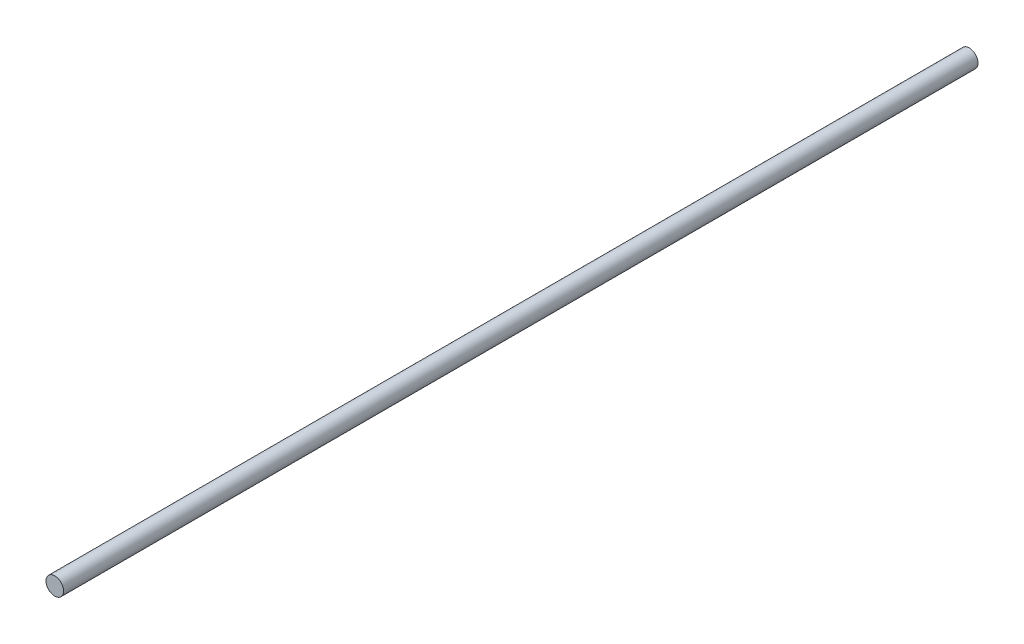
ISO-10303-21;
HEADER;
FILE_DESCRIPTION(('STEP AP214'),'2;1');
FILE_NAME('part.step','',(''),(''),'','','');
FILE_SCHEMA(('AUTOMOTIVE_DESIGN { 1 0 10303 214 1 1 1 1 }'));
ENDSEC;
DATA;
#1=APPLICATION_CONTEXT('core data for automotive mechanical design processes');
#2=APPLICATION_PROTOCOL_DEFINITION('international standard','automotive_design',2000,#1);
#3=PRODUCT_CONTEXT('',#1,'mechanical');
#4=PRODUCT('Part','Part','',(#3));
#5=PRODUCT_RELATED_PRODUCT_CATEGORY('part','',(#4));
#6=PRODUCT_DEFINITION_FORMATION('','',#4);
#7=PRODUCT_DEFINITION_CONTEXT('part definition',#1,'design');
#8=PRODUCT_DEFINITION('design','',#6,#7);
#9=PRODUCT_DEFINITION_SHAPE('','',#8);
#10=(LENGTH_UNIT() NAMED_UNIT(*) SI_UNIT(.MILLI.,.METRE.));
#11=(NAMED_UNIT(*) PLANE_ANGLE_UNIT() SI_UNIT($,.RADIAN.));
#12=(NAMED_UNIT(*) SI_UNIT($,.STERADIAN.) SOLID_ANGLE_UNIT());
#13=UNCERTAINTY_MEASURE_WITH_UNIT(LENGTH_MEASURE(1.E-05),#10,'distance_accuracy_value','');
#14=(GEOMETRIC_REPRESENTATION_CONTEXT(3) GLOBAL_UNCERTAINTY_ASSIGNED_CONTEXT((#13)) GLOBAL_UNIT_ASSIGNED_CONTEXT((#10,
#11,#12)) REPRESENTATION_CONTEXT('',''));
#15=CARTESIAN_POINT('',(0.,0.,0.));
#16=DIRECTION('',(0.,0.,1.));
#17=DIRECTION('',(1.,0.,0.));
#18=AXIS2_PLACEMENT_3D('',#15,#16,#17);
#19=CARTESIAN_POINT('',(0.,0.,104.));
#20=DIRECTION('',(0.,0.,-1.));
#21=DIRECTION('',(-1.,0.,0.));
#22=AXIS2_PLACEMENT_3D('',#19,#20,#21);
#23=CYLINDRICAL_SURFACE('',#22,1.);
#24=CARTESIAN_POINT('',(0.,0.,104.));
#25=DIRECTION('',(0.,0.,1.));
#26=DIRECTION('',(1.,0.,0.));
#27=AXIS2_PLACEMENT_3D('',#24,#25,#26);
#28=CIRCLE('',#27,1.);
#29=CARTESIAN_POINT('',(-1.,0.,104.));
#30=VERTEX_POINT('',#29);
#31=EDGE_CURVE('E10',#30,#30,#28,.T.);
#32=CARTESIAN_POINT('',(0.,0.,0.));
#33=DIRECTION('',(0.,0.,1.));
#34=DIRECTION('',(1.,0.,0.));
#35=AXIS2_PLACEMENT_3D('',#32,#33,#34);
#36=CIRCLE('',#35,1.);
#37=CARTESIAN_POINT('',(-1.,0.,0.));
#38=VERTEX_POINT('',#37);
#39=EDGE_CURVE('E34',#38,#38,#36,.T.);
#40=CARTESIAN_POINT('',(-1.,0.,104.));
#41=CARTESIAN_POINT('',(-1.,0.,102.916666666667));
#42=CARTESIAN_POINT('',(-1.,0.,101.833333333333));
#43=CARTESIAN_POINT('',(-1.,0.,99.6666666666667));
#44=CARTESIAN_POINT('',(-1.,0.,98.5833333333333));
#45=CARTESIAN_POINT('',(-1.,0.,96.4166666666667));
#46=CARTESIAN_POINT('',(-1.,0.,95.3333333333333));
#47=CARTESIAN_POINT('',(-1.,0.,93.1666666666666));
#48=CARTESIAN_POINT('',(-1.,0.,92.0833333333333));
#49=CARTESIAN_POINT('',(-1.,0.,89.9166666666667));
#50=CARTESIAN_POINT('',(-1.,0.,88.8333333333333));
#51=CARTESIAN_POINT('',(-1.,0.,86.6666666666667));
#52=CARTESIAN_POINT('',(-1.,0.,85.5833333333333));
#53=CARTESIAN_POINT('',(-1.,0.,83.4166666666667));
#54=CARTESIAN_POINT('',(-1.,0.,82.3333333333333));
#55=CARTESIAN_POINT('',(-1.,0.,80.1666666666666));
#56=CARTESIAN_POINT('',(-1.,0.,79.0833333333333));
#57=CARTESIAN_POINT('',(-1.,0.,76.9166666666666));
#58=CARTESIAN_POINT('',(-1.,0.,75.8333333333333));
#59=CARTESIAN_POINT('',(-1.,0.,73.6666666666667));
#60=CARTESIAN_POINT('',(-1.,0.,72.5833333333333));
#61=CARTESIAN_POINT('',(-1.,0.,70.4166666666667));
#62=CARTESIAN_POINT('',(-1.,0.,69.3333333333333));
#63=CARTESIAN_POINT('',(-1.,0.,67.1666666666667));
#64=CARTESIAN_POINT('',(-1.,0.,66.0833333333333));
#65=CARTESIAN_POINT('',(-1.,0.,63.9166666666667));
#66=CARTESIAN_POINT('',(-1.,0.,62.8333333333333));
#67=CARTESIAN_POINT('',(-1.,0.,60.6666666666667));
#68=CARTESIAN_POINT('',(-1.,0.,59.5833333333333));
#69=CARTESIAN_POINT('',(-1.,0.,57.4166666666667));
#70=CARTESIAN_POINT('',(-1.,0.,56.3333333333333));
#71=CARTESIAN_POINT('',(-1.,0.,54.1666666666667));
#72=CARTESIAN_POINT('',(-1.,0.,53.0833333333333));
#73=CARTESIAN_POINT('',(-1.,0.,50.9166666666667));
#74=CARTESIAN_POINT('',(-1.,0.,49.8333333333333));
#75=CARTESIAN_POINT('',(-1.,0.,47.6666666666667));
#76=CARTESIAN_POINT('',(-1.,0.,46.5833333333333));
#77=CARTESIAN_POINT('',(-1.,0.,44.4166666666667));
#78=CARTESIAN_POINT('',(-1.,0.,43.3333333333333));
#79=CARTESIAN_POINT('',(-1.,0.,41.1666666666667));
#80=CARTESIAN_POINT('',(-1.,0.,40.0833333333333));
#81=CARTESIAN_POINT('',(-1.,0.,37.9166666666667));
#82=CARTESIAN_POINT('',(-1.,0.,36.8333333333333));
#83=CARTESIAN_POINT('',(-1.,0.,34.6666666666667));
#84=CARTESIAN_POINT('',(-1.,0.,33.5833333333333));
#85=CARTESIAN_POINT('',(-1.,0.,31.4166666666667));
#86=CARTESIAN_POINT('',(-1.,0.,30.3333333333333));
#87=CARTESIAN_POINT('',(-1.,0.,28.1666666666667));
#88=CARTESIAN_POINT('',(-1.,0.,27.0833333333333));
#89=CARTESIAN_POINT('',(-1.,0.,24.9166666666667));
#90=CARTESIAN_POINT('',(-1.,0.,23.8333333333333));
#91=CARTESIAN_POINT('',(-1.,0.,21.6666666666667));
#92=CARTESIAN_POINT('',(-1.,0.,20.5833333333333));
#93=CARTESIAN_POINT('',(-1.,0.,18.4166666666667));
#94=CARTESIAN_POINT('',(-1.,0.,17.3333333333333));
#95=CARTESIAN_POINT('',(-1.,0.,15.1666666666667));
#96=CARTESIAN_POINT('',(-1.,0.,14.0833333333333));
#97=CARTESIAN_POINT('',(-1.,0.,11.9166666666667));
#98=CARTESIAN_POINT('',(-1.,0.,10.8333333333333));
#99=CARTESIAN_POINT('',(-1.,0.,8.66666666666666));
#100=CARTESIAN_POINT('',(-1.,0.,7.58333333333333));
#101=CARTESIAN_POINT('',(-1.,0.,5.41666666666667));
#102=CARTESIAN_POINT('',(-1.,0.,4.33333333333334));
#103=CARTESIAN_POINT('',(-1.,0.,2.16666666666667));
#104=CARTESIAN_POINT('',(-1.,0.,1.08333333333333));
#105=CARTESIAN_POINT('',(-1.,0.,0.));
#106=B_SPLINE_CURVE_WITH_KNOTS('',3,(#40,#41,#42,#43,#44,#45,#46,#47,#48,#49,#50,#51,#52,#53,
#54,#55,#56,#57,#58,#59,#60,#61,#62,#63,#64,#65,#66,#67,#68,#69,#70,#71,#72,#73,#74,#75,#76,#77,
#78,#79,#80,#81,#82,#83,#84,#85,#86,#87,#88,#89,#90,#91,#92,#93,#94,#95,#96,#97,#98,#99,#100,
#101,#102,#103,#104,#105),.UNSPECIFIED.,.F.,.F.,(4,2,2,2,2,2,2,2,2,2,2,2,2,2,2,2,2,2,2,2,2,2,2,
2,2,2,2,2,2,2,2,2,4),(0.,3.25,6.50000000000001,9.75000000000001,13.,16.25,19.5,22.75,26.,29.25,
32.5,35.75,39.,42.25,45.5,48.75,52.,55.25,58.5,61.75,65.,68.25,71.5,74.75,78.,81.25,84.5,87.75,
91.,94.25,97.5,100.75,104.),.UNSPECIFIED.);
#107=EDGE_CURVE('BSEAM31',#30,#38,#106,.T.);
#108=ORIENTED_EDGE('',*,*,#31,.F.);
#109=ORIENTED_EDGE('',*,*,#39,.T.);
#110=ORIENTED_EDGE('',*,*,#107,.T.);
#111=ORIENTED_EDGE('',*,*,#107,.F.);
#112=EDGE_LOOP('',(#108,#110,#109,#111));
#113=FACE_BOUND('',#112,.T.);
#114=ADVANCED_FACE('F31',(#113),#23,.T.);
#115=CARTESIAN_POINT('',(0.,0.,104.));
#116=DIRECTION('',(0.,0.,1.));
#117=DIRECTION('',(1.,0.,0.));
#118=AXIS2_PLACEMENT_3D('',#115,#116,#117);
#119=PLANE('',#118);
#120=ORIENTED_EDGE('',*,*,#31,.T.);
#121=EDGE_LOOP('',(#120));
#122=FACE_BOUND('',#121,.T.);
#123=ADVANCED_FACE('F46',(#122),#119,.T.);
#124=CARTESIAN_POINT('',(0.,0.,0.));
#125=DIRECTION('',(0.,0.,1.));
#126=DIRECTION('',(1.,0.,0.));
#127=AXIS2_PLACEMENT_3D('',#124,#125,#126);
#128=PLANE('',#127);
#129=ORIENTED_EDGE('',*,*,#39,.F.);
#130=EDGE_LOOP('',(#129));
#131=FACE_BOUND('',#130,.T.);
#132=ADVANCED_FACE('F44',(#131),#128,.F.);
#133=CLOSED_SHELL('',(#114,#123,#132));
#134=MANIFOLD_SOLID_BREP('B2',#133);
#135=ADVANCED_BREP_SHAPE_REPRESENTATION('',(#18,#134),#14);
#136=SHAPE_DEFINITION_REPRESENTATION(#9,#135);
ENDSEC;
END-ISO-10303-21;
